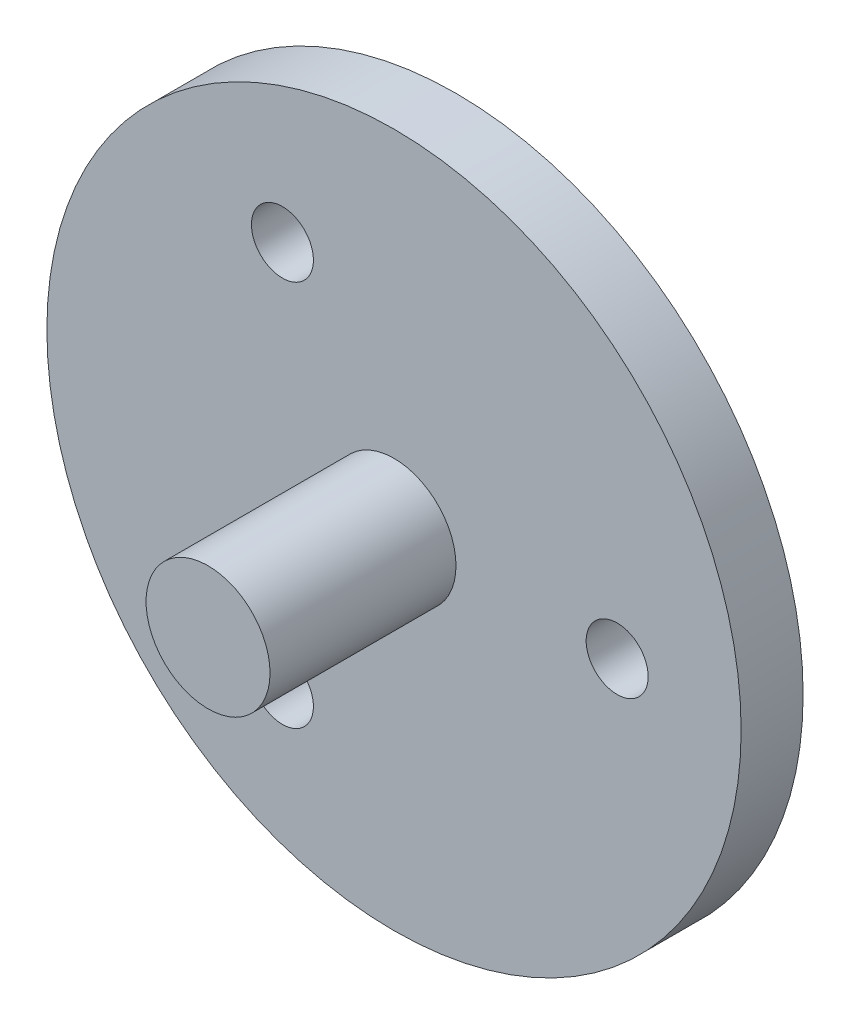
ISO-10303-21;
HEADER;
FILE_DESCRIPTION(('STEP AP214'),'2;1');
FILE_NAME('part.step','',(''),(''),'','','');
FILE_SCHEMA(('AUTOMOTIVE_DESIGN { 1 0 10303 214 1 1 1 1 }'));
ENDSEC;
DATA;
#1=APPLICATION_CONTEXT('core data for automotive mechanical design processes');
#2=APPLICATION_PROTOCOL_DEFINITION('international standard','automotive_design',2000,#1);
#3=PRODUCT_CONTEXT('',#1,'mechanical');
#4=PRODUCT('Part','Part','',(#3));
#5=PRODUCT_RELATED_PRODUCT_CATEGORY('part','',(#4));
#6=PRODUCT_DEFINITION_FORMATION('','',#4);
#7=PRODUCT_DEFINITION_CONTEXT('part definition',#1,'design');
#8=PRODUCT_DEFINITION('design','',#6,#7);
#9=PRODUCT_DEFINITION_SHAPE('','',#8);
#10=(LENGTH_UNIT() NAMED_UNIT(*) SI_UNIT(.MILLI.,.METRE.));
#11=(NAMED_UNIT(*) PLANE_ANGLE_UNIT() SI_UNIT($,.RADIAN.));
#12=(NAMED_UNIT(*) SI_UNIT($,.STERADIAN.) SOLID_ANGLE_UNIT());
#13=UNCERTAINTY_MEASURE_WITH_UNIT(LENGTH_MEASURE(1.E-05),#10,'distance_accuracy_value','');
#14=(GEOMETRIC_REPRESENTATION_CONTEXT(3) GLOBAL_UNCERTAINTY_ASSIGNED_CONTEXT((#13)) GLOBAL_UNIT_ASSIGNED_CONTEXT((#10,
#11,#12)) REPRESENTATION_CONTEXT('',''));
#15=CARTESIAN_POINT('',(0.,0.,0.));
#16=DIRECTION('',(0.,0.,1.));
#17=DIRECTION('',(1.,0.,0.));
#18=AXIS2_PLACEMENT_3D('',#15,#16,#17);
#19=CARTESIAN_POINT('',(0.,0.,10.));
#20=DIRECTION('',(0.,0.,-1.));
#21=DIRECTION('',(-1.,0.,0.));
#22=AXIS2_PLACEMENT_3D('',#19,#20,#21);
#23=CYLINDRICAL_SURFACE('',#22,56.);
#24=CARTESIAN_POINT('',(0.,0.,10.));
#25=DIRECTION('',(0.,0.,1.));
#26=DIRECTION('',(1.,0.,0.));
#27=AXIS2_PLACEMENT_3D('',#24,#25,#26);
#28=CIRCLE('',#27,56.);
#29=CARTESIAN_POINT('',(56.,0.,10.));
#30=VERTEX_POINT('',#29);
#31=EDGE_CURVE('E42',#30,#30,#28,.T.);
#32=ORIENTED_EDGE('',*,*,#31,.F.);
#33=EDGE_LOOP('',(#32));
#34=FACE_BOUND('',#33,.T.);
#35=CARTESIAN_POINT('',(0.,0.,0.));
#36=DIRECTION('',(0.,0.,1.));
#37=DIRECTION('',(1.,0.,0.));
#38=AXIS2_PLACEMENT_3D('',#35,#36,#37);
#39=CIRCLE('',#38,56.);
#40=CARTESIAN_POINT('',(56.,0.,0.));
#41=VERTEX_POINT('',#40);
#42=EDGE_CURVE('E37',#41,#41,#39,.T.);
#43=ORIENTED_EDGE('',*,*,#42,.T.);
#44=EDGE_LOOP('',(#43));
#45=FACE_BOUND('',#44,.T.);
#46=ADVANCED_FACE('F40',(#34,#45),#23,.T.);
#47=CARTESIAN_POINT('',(0.,0.,10.));
#48=DIRECTION('',(0.,0.,1.));
#49=DIRECTION('',(1.,0.,0.));
#50=AXIS2_PLACEMENT_3D('',#47,#48,#49);
#51=PLANE('',#50);
#52=CARTESIAN_POINT('',(36.,0.,10.));
#53=DIRECTION('',(0.,0.,1.));
#54=DIRECTION('',(1.,0.,0.));
#55=AXIS2_PLACEMENT_3D('',#52,#53,#54);
#56=CIRCLE('',#55,5.);
#57=CARTESIAN_POINT('',(41.,0.,10.));
#58=VERTEX_POINT('',#57);
#59=EDGE_CURVE('E68',#58,#58,#56,.T.);
#60=ORIENTED_EDGE('',*,*,#59,.F.);
#61=EDGE_LOOP('',(#60));
#62=FACE_BOUND('',#61,.T.);
#63=CARTESIAN_POINT('',(-18.,31.1769145362398,10.));
#64=DIRECTION('',(0.,0.,1.));
#65=DIRECTION('',(1.,0.,0.));
#66=AXIS2_PLACEMENT_3D('',#63,#64,#65);
#67=CIRCLE('',#66,5.);
#68=CARTESIAN_POINT('',(-13.,31.1769145362398,10.));
#69=VERTEX_POINT('',#68);
#70=EDGE_CURVE('E62',#69,#69,#67,.T.);
#71=ORIENTED_EDGE('',*,*,#70,.F.);
#72=EDGE_LOOP('',(#71));
#73=FACE_BOUND('',#72,.T.);
#74=CARTESIAN_POINT('',(-18.,-31.1769145362398,10.));
#75=DIRECTION('',(0.,0.,1.));
#76=DIRECTION('',(1.,0.,0.));
#77=AXIS2_PLACEMENT_3D('',#74,#75,#76);
#78=CIRCLE('',#77,4.99999999999998);
#79=CARTESIAN_POINT('',(-13.,-31.1769145362398,10.));
#80=VERTEX_POINT('',#79);
#81=EDGE_CURVE('E60',#80,#80,#78,.T.);
#82=ORIENTED_EDGE('',*,*,#81,.F.);
#83=EDGE_LOOP('',(#82));
#84=FACE_BOUND('',#83,.T.);
#85=CARTESIAN_POINT('',(0.,0.,10.));
#86=DIRECTION('',(0.,0.,1.));
#87=DIRECTION('',(1.,0.,0.));
#88=AXIS2_PLACEMENT_3D('',#85,#86,#87);
#89=CIRCLE('',#88,10.);
#90=CARTESIAN_POINT('',(10.,0.,10.));
#91=VERTEX_POINT('',#90);
#92=EDGE_CURVE('E10',#91,#91,#89,.T.);
#93=ORIENTED_EDGE('',*,*,#92,.F.);
#94=EDGE_LOOP('',(#93));
#95=FACE_BOUND('',#94,.T.);
#96=ORIENTED_EDGE('',*,*,#31,.T.);
#97=EDGE_LOOP('',(#96));
#98=FACE_BOUND('',#97,.T.);
#99=ADVANCED_FACE('F84',(#62,#73,#84,#95,#98),#51,.T.);
#100=CARTESIAN_POINT('',(0.,0.,0.));
#101=DIRECTION('',(0.,0.,1.));
#102=DIRECTION('',(1.,0.,0.));
#103=AXIS2_PLACEMENT_3D('',#100,#101,#102);
#104=PLANE('',#103);
#105=CARTESIAN_POINT('',(36.,0.,0.));
#106=DIRECTION('',(0.,0.,1.));
#107=DIRECTION('',(1.,0.,0.));
#108=AXIS2_PLACEMENT_3D('',#105,#106,#107);
#109=CIRCLE('',#108,5.);
#110=CARTESIAN_POINT('',(41.,0.,0.));
#111=VERTEX_POINT('',#110);
#112=EDGE_CURVE('E52',#111,#111,#109,.T.);
#113=ORIENTED_EDGE('',*,*,#112,.T.);
#114=EDGE_LOOP('',(#113));
#115=FACE_BOUND('',#114,.T.);
#116=CARTESIAN_POINT('',(-18.,31.1769145362398,0.));
#117=DIRECTION('',(0.,0.,1.));
#118=DIRECTION('',(1.,0.,0.));
#119=AXIS2_PLACEMENT_3D('',#116,#117,#118);
#120=CIRCLE('',#119,5.);
#121=CARTESIAN_POINT('',(-13.,31.1769145362398,0.));
#122=VERTEX_POINT('',#121);
#123=EDGE_CURVE('E58',#122,#122,#120,.T.);
#124=ORIENTED_EDGE('',*,*,#123,.T.);
#125=EDGE_LOOP('',(#124));
#126=FACE_BOUND('',#125,.T.);
#127=CARTESIAN_POINT('',(-18.,-31.1769145362398,0.));
#128=DIRECTION('',(0.,0.,1.));
#129=DIRECTION('',(1.,0.,0.));
#130=AXIS2_PLACEMENT_3D('',#127,#128,#129);
#131=CIRCLE('',#130,4.99999999999998);
#132=CARTESIAN_POINT('',(-13.,-31.1769145362398,0.));
#133=VERTEX_POINT('',#132);
#134=EDGE_CURVE('E53',#133,#133,#131,.T.);
#135=ORIENTED_EDGE('',*,*,#134,.T.);
#136=EDGE_LOOP('',(#135));
#137=FACE_BOUND('',#136,.T.);
#138=ORIENTED_EDGE('',*,*,#42,.F.);
#139=EDGE_LOOP('',(#138));
#140=FACE_BOUND('',#139,.T.);
#141=ADVANCED_FACE('F75',(#115,#126,#137,#140),#104,.F.);
#142=CARTESIAN_POINT('',(0.,0.,40.));
#143=DIRECTION('',(0.,0.,-1.));
#144=DIRECTION('',(-1.,0.,0.));
#145=AXIS2_PLACEMENT_3D('',#142,#143,#144);
#146=CYLINDRICAL_SURFACE('',#145,10.);
#147=CARTESIAN_POINT('',(0.,0.,40.));
#148=DIRECTION('',(0.,0.,1.));
#149=DIRECTION('',(1.,0.,0.));
#150=AXIS2_PLACEMENT_3D('',#147,#148,#149);
#151=CIRCLE('',#150,10.);
#152=CARTESIAN_POINT('',(10.,0.,40.));
#153=VERTEX_POINT('',#152);
#154=EDGE_CURVE('E49',#153,#153,#151,.T.);
#155=ORIENTED_EDGE('',*,*,#154,.F.);
#156=EDGE_LOOP('',(#155));
#157=FACE_BOUND('',#156,.T.);
#158=ORIENTED_EDGE('',*,*,#92,.T.);
#159=EDGE_LOOP('',(#158));
#160=FACE_BOUND('',#159,.T.);
#161=ADVANCED_FACE('F97',(#157,#160),#146,.T.);
#162=CARTESIAN_POINT('',(0.,0.,40.));
#163=DIRECTION('',(0.,0.,1.));
#164=DIRECTION('',(1.,0.,0.));
#165=AXIS2_PLACEMENT_3D('',#162,#163,#164);
#166=PLANE('',#165);
#167=ORIENTED_EDGE('',*,*,#154,.T.);
#168=EDGE_LOOP('',(#167));
#169=FACE_BOUND('',#168,.T.);
#170=ADVANCED_FACE('F102',(#169),#166,.T.);
#171=CARTESIAN_POINT('',(-18.,-31.1769145362398,0.));
#172=DIRECTION('',(0.,0.,1.));
#173=DIRECTION('',(1.,0.,0.));
#174=AXIS2_PLACEMENT_3D('',#171,#172,#173);
#175=CYLINDRICAL_SURFACE('',#174,4.99999999999998);
#176=ORIENTED_EDGE('',*,*,#134,.F.);
#177=EDGE_LOOP('',(#176));
#178=FACE_BOUND('',#177,.T.);
#179=ORIENTED_EDGE('',*,*,#81,.T.);
#180=EDGE_LOOP('',(#179));
#181=FACE_BOUND('',#180,.T.);
#182=ADVANCED_FACE('F109',(#178,#181),#175,.F.);
#183=CARTESIAN_POINT('',(-18.,31.1769145362398,0.));
#184=DIRECTION('',(0.,0.,1.));
#185=DIRECTION('',(1.,0.,0.));
#186=AXIS2_PLACEMENT_3D('',#183,#184,#185);
#187=CYLINDRICAL_SURFACE('',#186,5.);
#188=ORIENTED_EDGE('',*,*,#123,.F.);
#189=EDGE_LOOP('',(#188));
#190=FACE_BOUND('',#189,.T.);
#191=ORIENTED_EDGE('',*,*,#70,.T.);
#192=EDGE_LOOP('',(#191));
#193=FACE_BOUND('',#192,.T.);
#194=ADVANCED_FACE('F77',(#190,#193),#187,.F.);
#195=CARTESIAN_POINT('',(36.,0.,0.));
#196=DIRECTION('',(0.,0.,1.));
#197=DIRECTION('',(1.,0.,0.));
#198=AXIS2_PLACEMENT_3D('',#195,#196,#197);
#199=CYLINDRICAL_SURFACE('',#198,5.);
#200=ORIENTED_EDGE('',*,*,#112,.F.);
#201=EDGE_LOOP('',(#200));
#202=FACE_BOUND('',#201,.T.);
#203=ORIENTED_EDGE('',*,*,#59,.T.);
#204=EDGE_LOOP('',(#203));
#205=FACE_BOUND('',#204,.T.);
#206=ADVANCED_FACE('F73',(#202,#205),#199,.F.);
#207=CLOSED_SHELL('',(#46,#99,#141,#161,#170,#182,#194,#206));
#208=MANIFOLD_SOLID_BREP('B2',#207);
#209=ADVANCED_BREP_SHAPE_REPRESENTATION('',(#18,#208),#14);
#210=SHAPE_DEFINITION_REPRESENTATION(#9,#209);
ENDSEC;
END-ISO-10303-21;
